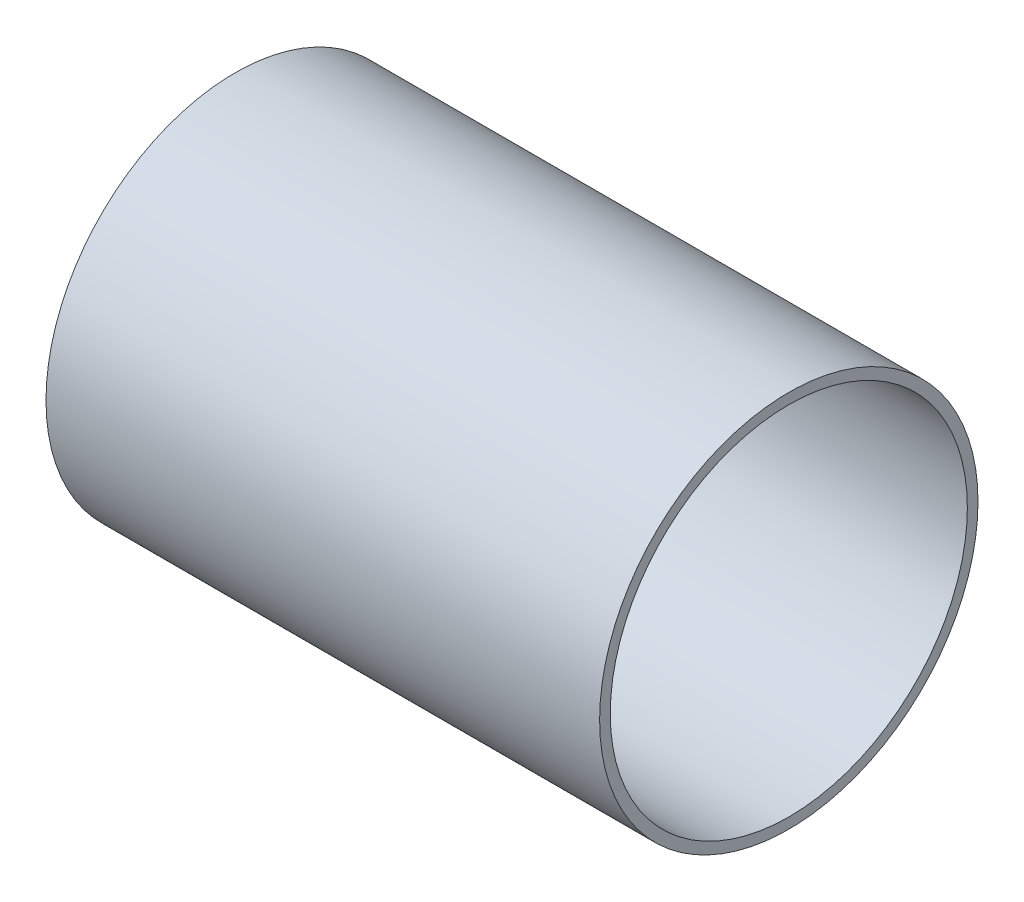
ISO-10303-21;
HEADER;
FILE_DESCRIPTION(('STEP AP214'),'2;1');
FILE_NAME('part.step','',(''),(''),'','','');
FILE_SCHEMA(('AUTOMOTIVE_DESIGN { 1 0 10303 214 1 1 1 1 }'));
ENDSEC;
DATA;
#1=APPLICATION_CONTEXT('core data for automotive mechanical design processes');
#2=APPLICATION_PROTOCOL_DEFINITION('international standard','automotive_design',2000,#1);
#3=PRODUCT_CONTEXT('',#1,'mechanical');
#4=PRODUCT('Part','Part','',(#3));
#5=PRODUCT_RELATED_PRODUCT_CATEGORY('part','',(#4));
#6=PRODUCT_DEFINITION_FORMATION('','',#4);
#7=PRODUCT_DEFINITION_CONTEXT('part definition',#1,'design');
#8=PRODUCT_DEFINITION('design','',#6,#7);
#9=PRODUCT_DEFINITION_SHAPE('','',#8);
#10=(LENGTH_UNIT() NAMED_UNIT(*) SI_UNIT(.MILLI.,.METRE.));
#11=(NAMED_UNIT(*) PLANE_ANGLE_UNIT() SI_UNIT($,.RADIAN.));
#12=(NAMED_UNIT(*) SI_UNIT($,.STERADIAN.) SOLID_ANGLE_UNIT());
#13=UNCERTAINTY_MEASURE_WITH_UNIT(LENGTH_MEASURE(1.E-05),#10,'distance_accuracy_value','');
#14=(GEOMETRIC_REPRESENTATION_CONTEXT(3) GLOBAL_UNCERTAINTY_ASSIGNED_CONTEXT((#13)) GLOBAL_UNIT_ASSIGNED_CONTEXT((#10,
#11,#12)) REPRESENTATION_CONTEXT('',''));
#15=CARTESIAN_POINT('',(0.,0.,0.));
#16=DIRECTION('',(0.,0.,1.));
#17=DIRECTION('',(1.,0.,0.));
#18=AXIS2_PLACEMENT_3D('',#15,#16,#17);
#19=CARTESIAN_POINT('',(29.1,0.,0.));
#20=DIRECTION('',(-1.,0.,0.));
#21=DIRECTION('',(0.,0.,1.));
#22=AXIS2_PLACEMENT_3D('',#19,#20,#21);
#23=PLANE('',#22);
#24=CARTESIAN_POINT('',(29.1,0.,0.));
#25=DIRECTION('',(-1.,0.,0.));
#26=DIRECTION('',(0.,0.,1.));
#27=AXIS2_PLACEMENT_3D('',#24,#25,#26);
#28=CIRCLE('',#27,7.55);
#29=CARTESIAN_POINT('',(29.1,0.,7.55));
#30=VERTEX_POINT('',#29);
#31=EDGE_CURVE('E33',#30,#30,#28,.F.);
#32=ORIENTED_EDGE('',*,*,#31,.T.);
#33=EDGE_LOOP('',(#32));
#34=FACE_BOUND('',#33,.T.);
#35=CARTESIAN_POINT('',(29.1,0.,0.));
#36=DIRECTION('',(1.,0.,0.));
#37=DIRECTION('',(0.,0.,-1.));
#38=AXIS2_PLACEMENT_3D('',#35,#36,#37);
#39=CIRCLE('',#38,3.);
#40=CARTESIAN_POINT('',(29.1,0.,-3.));
#41=VERTEX_POINT('',#40);
#42=EDGE_CURVE('E17',#41,#41,#39,.F.);
#43=ORIENTED_EDGE('',*,*,#42,.T.);
#44=EDGE_LOOP('',(#43));
#45=FACE_BOUND('',#44,.T.);
#46=ADVANCED_FACE('F14',(#34,#45),#23,.F.);
#47=CARTESIAN_POINT('',(33.995,0.,0.));
#48=DIRECTION('',(1.,0.,0.));
#49=DIRECTION('',(0.,0.,-1.));
#50=AXIS2_PLACEMENT_3D('',#47,#48,#49);
#51=CYLINDRICAL_SURFACE('',#50,3.);
#52=CARTESIAN_POINT('',(22.29,0.,0.));
#53=DIRECTION('',(1.,0.,0.));
#54=DIRECTION('',(0.,0.,-1.));
#55=AXIS2_PLACEMENT_3D('',#52,#53,#54);
#56=CIRCLE('',#55,3.);
#57=CARTESIAN_POINT('',(22.29,0.,-3.));
#58=VERTEX_POINT('',#57);
#59=EDGE_CURVE('E31',#58,#58,#56,.T.);
#60=ORIENTED_EDGE('',*,*,#59,.F.);
#61=EDGE_LOOP('',(#60));
#62=FACE_BOUND('',#61,.T.);
#63=ORIENTED_EDGE('',*,*,#42,.F.);
#64=EDGE_LOOP('',(#63));
#65=FACE_BOUND('',#64,.T.);
#66=ADVANCED_FACE('F41',(#62,#65),#51,.F.);
#67=CARTESIAN_POINT('',(37.4,0.,0.));
#68=DIRECTION('',(-1.,0.,0.));
#69=DIRECTION('',(0.,0.,1.));
#70=AXIS2_PLACEMENT_3D('',#67,#68,#69);
#71=CYLINDRICAL_SURFACE('',#70,7.55);
#72=CARTESIAN_POINT('',(45.7,0.,0.));
#73=DIRECTION('',(-1.,0.,0.));
#74=DIRECTION('',(0.,0.,1.));
#75=AXIS2_PLACEMENT_3D('',#72,#73,#74);
#76=CIRCLE('',#75,7.55);
#77=CARTESIAN_POINT('',(45.7,0.,7.55));
#78=VERTEX_POINT('',#77);
#79=EDGE_CURVE('E26',#78,#78,#76,.T.);
#80=ORIENTED_EDGE('',*,*,#79,.F.);
#81=EDGE_LOOP('',(#80));
#82=FACE_BOUND('',#81,.T.);
#83=ORIENTED_EDGE('',*,*,#31,.F.);
#84=EDGE_LOOP('',(#83));
#85=FACE_BOUND('',#84,.T.);
#86=ADVANCED_FACE('F43',(#82,#85),#71,.F.);
#87=CARTESIAN_POINT('',(22.29,0.,5.5));
#88=DIRECTION('',(-1.,0.,0.));
#89=DIRECTION('',(0.,0.,1.));
#90=AXIS2_PLACEMENT_3D('',#87,#88,#89);
#91=PLANE('',#90);
#92=ORIENTED_EDGE('',*,*,#59,.T.);
#93=EDGE_LOOP('',(#92));
#94=FACE_BOUND('',#93,.T.);
#95=CARTESIAN_POINT('',(22.29,0.,0.));
#96=DIRECTION('',(1.,0.,0.));
#97=DIRECTION('',(0.,0.,-1.));
#98=AXIS2_PLACEMENT_3D('',#95,#96,#97);
#99=CIRCLE('',#98,8.);
#100=CARTESIAN_POINT('',(22.29,0.,-8.));
#101=VERTEX_POINT('',#100);
#102=EDGE_CURVE('E21',#101,#101,#99,.T.);
#103=ORIENTED_EDGE('',*,*,#102,.F.);
#104=EDGE_LOOP('',(#103));
#105=FACE_BOUND('',#104,.T.);
#106=ADVANCED_FACE('F50',(#94,#105),#91,.T.);
#107=CARTESIAN_POINT('',(45.7,0.,5.5));
#108=DIRECTION('',(1.,0.,0.));
#109=DIRECTION('',(0.,0.,-1.));
#110=AXIS2_PLACEMENT_3D('',#107,#108,#109);
#111=PLANE('',#110);
#112=CARTESIAN_POINT('',(45.7,0.,0.));
#113=DIRECTION('',(1.,0.,0.));
#114=DIRECTION('',(0.,0.,-1.));
#115=AXIS2_PLACEMENT_3D('',#112,#113,#114);
#116=CIRCLE('',#115,8.);
#117=CARTESIAN_POINT('',(45.7,0.,-8.));
#118=VERTEX_POINT('',#117);
#119=EDGE_CURVE('E9',#118,#118,#116,.F.);
#120=ORIENTED_EDGE('',*,*,#119,.F.);
#121=EDGE_LOOP('',(#120));
#122=FACE_BOUND('',#121,.T.);
#123=ORIENTED_EDGE('',*,*,#79,.T.);
#124=EDGE_LOOP('',(#123));
#125=FACE_BOUND('',#124,.T.);
#126=ADVANCED_FACE('F56',(#122,#125),#111,.T.);
#127=CARTESIAN_POINT('',(33.995,0.,0.));
#128=DIRECTION('',(1.,0.,0.));
#129=DIRECTION('',(0.,0.,-1.));
#130=AXIS2_PLACEMENT_3D('',#127,#128,#129);
#131=CYLINDRICAL_SURFACE('',#130,8.);
#132=ORIENTED_EDGE('',*,*,#102,.T.);
#133=EDGE_LOOP('',(#132));
#134=FACE_BOUND('',#133,.T.);
#135=ORIENTED_EDGE('',*,*,#119,.T.);
#136=EDGE_LOOP('',(#135));
#137=FACE_BOUND('',#136,.T.);
#138=ADVANCED_FACE('F54',(#134,#137),#131,.T.);
#139=CLOSED_SHELL('',(#46,#66,#86,#106,#126,#138));
#140=MANIFOLD_SOLID_BREP('B1',#139);
#141=ADVANCED_BREP_SHAPE_REPRESENTATION('',(#18,#140),#14);
#142=SHAPE_DEFINITION_REPRESENTATION(#9,#141);
ENDSEC;
END-ISO-10303-21;
